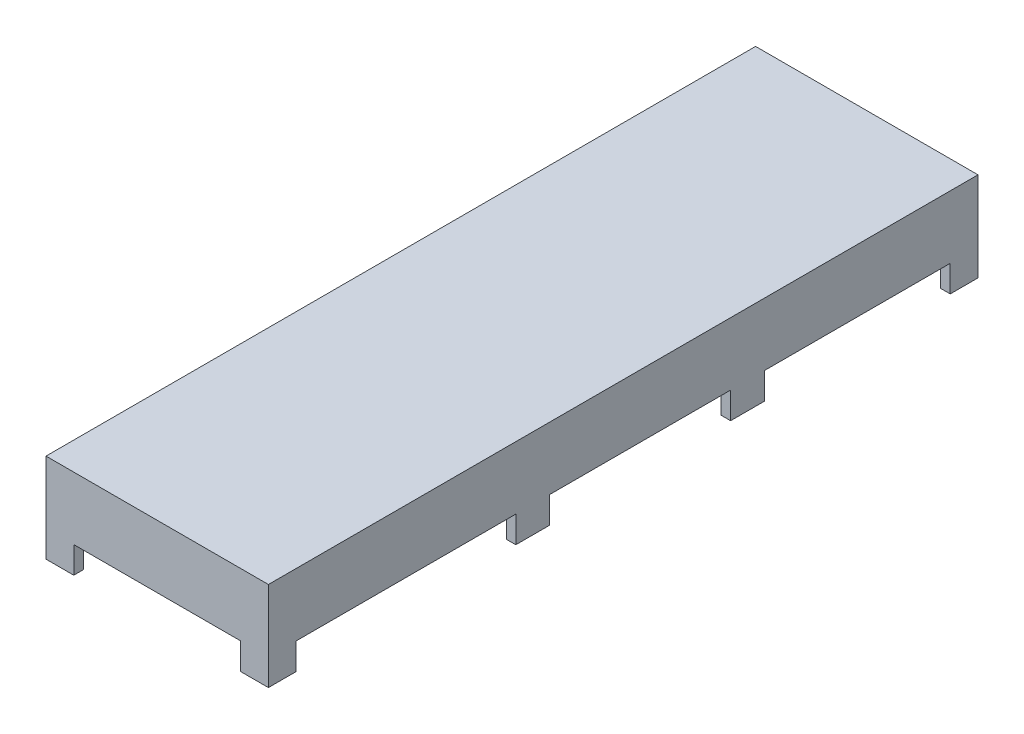
ISO-10303-21;
HEADER;
FILE_DESCRIPTION(('STEP AP214'),'2;1');
FILE_NAME('part.step','',(''),(''),'','','');
FILE_SCHEMA(('AUTOMOTIVE_DESIGN { 1 0 10303 214 1 1 1 1 }'));
ENDSEC;
DATA;
#1=APPLICATION_CONTEXT('core data for automotive mechanical design processes');
#2=APPLICATION_PROTOCOL_DEFINITION('international standard','automotive_design',2000,#1);
#3=PRODUCT_CONTEXT('',#1,'mechanical');
#4=PRODUCT('Part','Part','',(#3));
#5=PRODUCT_RELATED_PRODUCT_CATEGORY('part','',(#4));
#6=PRODUCT_DEFINITION_FORMATION('','',#4);
#7=PRODUCT_DEFINITION_CONTEXT('part definition',#1,'design');
#8=PRODUCT_DEFINITION('design','',#6,#7);
#9=PRODUCT_DEFINITION_SHAPE('','',#8);
#10=(LENGTH_UNIT() NAMED_UNIT(*) SI_UNIT(.MILLI.,.METRE.));
#11=(NAMED_UNIT(*) PLANE_ANGLE_UNIT() SI_UNIT($,.RADIAN.));
#12=(NAMED_UNIT(*) SI_UNIT($,.STERADIAN.) SOLID_ANGLE_UNIT());
#13=UNCERTAINTY_MEASURE_WITH_UNIT(LENGTH_MEASURE(1.E-05),#10,'distance_accuracy_value','');
#14=(GEOMETRIC_REPRESENTATION_CONTEXT(3) GLOBAL_UNCERTAINTY_ASSIGNED_CONTEXT((#13)) GLOBAL_UNIT_ASSIGNED_CONTEXT((#10,
#11,#12)) REPRESENTATION_CONTEXT('',''));
#15=CARTESIAN_POINT('',(0.,0.,0.));
#16=DIRECTION('',(0.,0.,1.));
#17=DIRECTION('',(1.,0.,0.));
#18=AXIS2_PLACEMENT_3D('',#15,#16,#17);
#19=CARTESIAN_POINT('',(0.,0.,0.));
#20=DIRECTION('',(0.,-1.,0.));
#21=DIRECTION('',(0.,0.,-1.));
#22=AXIS2_PLACEMENT_3D('',#19,#20,#21);
#23=PLANE('',#22);
#24=DIRECTION('',(0.,0.,-1.));
#25=VECTOR('',#24,1.);
#26=CARTESIAN_POINT('',(0.4,0.,-0.4));
#27=LINE('',#26,#25);
#28=CARTESIAN_POINT('',(0.399999999999999,0.,-28.25));
#29=VERTEX_POINT('',#28);
#30=CARTESIAN_POINT('',(0.4,0.,-29.));
#31=VERTEX_POINT('',#30);
#32=EDGE_CURVE('E534',#29,#31,#27,.T.);
#33=ORIENTED_EDGE('',*,*,#32,.F.);
#34=DIRECTION('',(-1.,0.,0.));
#35=VECTOR('',#34,1.);
#36=CARTESIAN_POINT('',(9.99999999999999,0.,-28.25));
#37=LINE('',#36,#35);
#38=CARTESIAN_POINT('',(0.,0.,-28.25));
#39=VERTEX_POINT('',#38);
#40=EDGE_CURVE('E399',#29,#39,#37,.T.);
#41=ORIENTED_EDGE('',*,*,#40,.T.);
#42=DIRECTION('',(0.,0.,-1.));
#43=VECTOR('',#42,1.);
#44=CARTESIAN_POINT('',(0.,0.,0.));
#45=LINE('',#44,#43);
#46=CARTESIAN_POINT('',(0.,0.,-29.4));
#47=VERTEX_POINT('',#46);
#48=EDGE_CURVE('E324',#39,#47,#45,.T.);
#49=ORIENTED_EDGE('',*,*,#48,.T.);
#50=DIRECTION('',(1.,0.,0.));
#51=VECTOR('',#50,1.);
#52=CARTESIAN_POINT('',(0.,0.,-29.4));
#53=LINE('',#52,#51);
#54=CARTESIAN_POINT('',(1.15,0.,-29.4));
#55=VERTEX_POINT('',#54);
#56=EDGE_CURVE('E335',#47,#55,#53,.T.);
#57=ORIENTED_EDGE('',*,*,#56,.T.);
#58=DIRECTION('',(0.,0.,1.));
#59=VECTOR('',#58,1.);
#60=CARTESIAN_POINT('',(1.15,0.,-104.93962137689));
#61=LINE('',#60,#59);
#62=CARTESIAN_POINT('',(1.15,0.,-29.));
#63=VERTEX_POINT('',#62);
#64=EDGE_CURVE('E487',#55,#63,#61,.T.);
#65=ORIENTED_EDGE('',*,*,#64,.T.);
#66=DIRECTION('',(1.,0.,0.));
#67=VECTOR('',#66,1.);
#68=CARTESIAN_POINT('',(0.4,0.,-29.));
#69=LINE('',#68,#67);
#70=EDGE_CURVE('E552',#31,#63,#69,.T.);
#71=ORIENTED_EDGE('',*,*,#70,.F.);
#72=EDGE_LOOP('',(#33,#41,#49,#57,#65,#71));
#73=FACE_BOUND('',#72,.T.);
#74=ADVANCED_FACE('F41',(#73),#23,.T.);
#75=CARTESIAN_POINT('',(0.,0.,-19.15));
#76=VERTEX_POINT('',#75);
#77=CARTESIAN_POINT('',(0.,0.,-20.55));
#78=VERTEX_POINT('',#77);
#79=EDGE_CURVE('E314',#76,#78,#45,.T.);
#80=ORIENTED_EDGE('',*,*,#79,.T.);
#81=DIRECTION('',(-1.,0.,0.));
#82=VECTOR('',#81,1.);
#83=CARTESIAN_POINT('',(9.99999999999999,0.,-20.55));
#84=LINE('',#83,#82);
#85=CARTESIAN_POINT('',(0.399999999999999,0.,-20.55));
#86=VERTEX_POINT('',#85);
#87=EDGE_CURVE('E296',#86,#78,#84,.T.);
#88=ORIENTED_EDGE('',*,*,#87,.F.);
#89=CARTESIAN_POINT('',(0.399999999999999,0.,-19.15));
#90=VERTEX_POINT('',#89);
#91=EDGE_CURVE('E724',#90,#86,#27,.T.);
#92=ORIENTED_EDGE('',*,*,#91,.F.);
#93=DIRECTION('',(-1.,0.,0.));
#94=VECTOR('',#93,1.);
#95=CARTESIAN_POINT('',(9.99999999999999,0.,-19.15));
#96=LINE('',#95,#94);
#97=EDGE_CURVE('E322',#90,#76,#96,.T.);
#98=ORIENTED_EDGE('',*,*,#97,.T.);
#99=EDGE_LOOP('',(#80,#88,#92,#98));
#100=FACE_BOUND('',#99,.T.);
#101=ADVANCED_FACE('F321',(#100),#23,.T.);
#102=CARTESIAN_POINT('',(0.399999999999999,0.,-10.25));
#103=VERTEX_POINT('',#102);
#104=CARTESIAN_POINT('',(0.399999999999999,0.,-11.65));
#105=VERTEX_POINT('',#104);
#106=EDGE_CURVE('E551',#103,#105,#27,.T.);
#107=ORIENTED_EDGE('',*,*,#106,.F.);
#108=DIRECTION('',(-1.,0.,0.));
#109=VECTOR('',#108,1.);
#110=CARTESIAN_POINT('',(9.99999999999999,0.,-10.25));
#111=LINE('',#110,#109);
#112=CARTESIAN_POINT('',(0.,0.,-10.25));
#113=VERTEX_POINT('',#112);
#114=EDGE_CURVE('E417',#103,#113,#111,.T.);
#115=ORIENTED_EDGE('',*,*,#114,.T.);
#116=CARTESIAN_POINT('',(0.,0.,-11.65));
#117=VERTEX_POINT('',#116);
#118=EDGE_CURVE('E323',#113,#117,#45,.T.);
#119=ORIENTED_EDGE('',*,*,#118,.T.);
#120=DIRECTION('',(-1.,0.,0.));
#121=VECTOR('',#120,1.);
#122=CARTESIAN_POINT('',(9.99999999999999,0.,-11.65));
#123=LINE('',#122,#121);
#124=EDGE_CURVE('E429',#105,#117,#123,.T.);
#125=ORIENTED_EDGE('',*,*,#124,.F.);
#126=EDGE_LOOP('',(#107,#115,#119,#125));
#127=FACE_BOUND('',#126,.T.);
#128=ADVANCED_FACE('F677',(#127),#23,.T.);
#129=CARTESIAN_POINT('',(0.,0.,0.));
#130=VERTEX_POINT('',#129);
#131=CARTESIAN_POINT('',(0.,0.,-1.15));
#132=VERTEX_POINT('',#131);
#133=EDGE_CURVE('E327',#130,#132,#45,.T.);
#134=ORIENTED_EDGE('',*,*,#133,.T.);
#135=DIRECTION('',(-1.,0.,0.));
#136=VECTOR('',#135,1.);
#137=CARTESIAN_POINT('',(9.99999999999999,0.,-1.15));
#138=LINE('',#137,#136);
#139=CARTESIAN_POINT('',(0.399999999999999,0.,-1.15));
#140=VERTEX_POINT('',#139);
#141=EDGE_CURVE('E408',#140,#132,#138,.T.);
#142=ORIENTED_EDGE('',*,*,#141,.F.);
#143=CARTESIAN_POINT('',(0.4,0.,-0.4));
#144=VERTEX_POINT('',#143);
#145=EDGE_CURVE('E547',#144,#140,#27,.T.);
#146=ORIENTED_EDGE('',*,*,#145,.F.);
#147=DIRECTION('',(1.,0.,0.));
#148=VECTOR('',#147,1.);
#149=CARTESIAN_POINT('',(0.4,0.,-0.4));
#150=LINE('',#149,#148);
#151=CARTESIAN_POINT('',(1.15,0.,-0.399999999999999));
#152=VERTEX_POINT('',#151);
#153=EDGE_CURVE('E539',#144,#152,#150,.T.);
#154=ORIENTED_EDGE('',*,*,#153,.T.);
#155=DIRECTION('',(0.,0.,-1.));
#156=VECTOR('',#155,1.);
#157=CARTESIAN_POINT('',(1.15,0.,38.7896213768902));
#158=LINE('',#157,#156);
#159=CARTESIAN_POINT('',(1.15,0.,0.));
#160=VERTEX_POINT('',#159);
#161=EDGE_CURVE('E511',#160,#152,#158,.T.);
#162=ORIENTED_EDGE('',*,*,#161,.F.);
#163=DIRECTION('',(1.,0.,0.));
#164=VECTOR('',#163,1.);
#165=CARTESIAN_POINT('',(0.,0.,0.));
#166=LINE('',#165,#164);
#167=EDGE_CURVE('E344',#130,#160,#166,.T.);
#168=ORIENTED_EDGE('',*,*,#167,.F.);
#169=EDGE_LOOP('',(#134,#142,#146,#154,#162,#168));
#170=FACE_BOUND('',#169,.T.);
#171=ADVANCED_FACE('F601',(#170),#23,.T.);
#172=DIRECTION('',(0.,0.,-1.));
#173=VECTOR('',#172,1.);
#174=CARTESIAN_POINT('',(9.215,0.,0.));
#175=LINE('',#174,#173);
#176=CARTESIAN_POINT('',(9.215,0.,-28.25));
#177=VERTEX_POINT('',#176);
#178=CARTESIAN_POINT('',(9.215,0.,-29.4));
#179=VERTEX_POINT('',#178);
#180=EDGE_CURVE('E338',#177,#179,#175,.T.);
#181=ORIENTED_EDGE('',*,*,#180,.F.);
#182=CARTESIAN_POINT('',(8.82,0.,-28.25));
#183=VERTEX_POINT('',#182);
#184=EDGE_CURVE('E403',#177,#183,#37,.T.);
#185=ORIENTED_EDGE('',*,*,#184,.T.);
#186=DIRECTION('',(0.,0.,-1.));
#187=VECTOR('',#186,1.);
#188=CARTESIAN_POINT('',(8.82,0.,-0.4));
#189=LINE('',#188,#187);
#190=CARTESIAN_POINT('',(8.82,0.,-29.));
#191=VERTEX_POINT('',#190);
#192=EDGE_CURVE('E555',#183,#191,#189,.T.);
#193=ORIENTED_EDGE('',*,*,#192,.T.);
#194=CARTESIAN_POINT('',(8.065,0.,-29.));
#195=VERTEX_POINT('',#194);
#196=EDGE_CURVE('E550',#195,#191,#69,.T.);
#197=ORIENTED_EDGE('',*,*,#196,.F.);
#198=DIRECTION('',(0.,0.,1.));
#199=VECTOR('',#198,1.);
#200=CARTESIAN_POINT('',(8.065,0.,-104.93962137689));
#201=LINE('',#200,#199);
#202=CARTESIAN_POINT('',(8.065,0.,-29.4));
#203=VERTEX_POINT('',#202);
#204=EDGE_CURVE('E500',#203,#195,#201,.T.);
#205=ORIENTED_EDGE('',*,*,#204,.F.);
#206=EDGE_CURVE('E332',#203,#179,#53,.T.);
#207=ORIENTED_EDGE('',*,*,#206,.T.);
#208=EDGE_LOOP('',(#181,#185,#193,#197,#205,#207));
#209=FACE_BOUND('',#208,.T.);
#210=ADVANCED_FACE('F689',(#209),#23,.T.);
#211=CARTESIAN_POINT('',(8.82,0.,-19.15));
#212=VERTEX_POINT('',#211);
#213=CARTESIAN_POINT('',(8.82,0.,-20.55));
#214=VERTEX_POINT('',#213);
#215=EDGE_CURVE('E655',#212,#214,#189,.T.);
#216=ORIENTED_EDGE('',*,*,#215,.T.);
#217=CARTESIAN_POINT('',(9.215,0.,-20.55));
#218=VERTEX_POINT('',#217);
#219=EDGE_CURVE('E307',#218,#214,#84,.T.);
#220=ORIENTED_EDGE('',*,*,#219,.F.);
#221=CARTESIAN_POINT('',(9.215,0.,-19.15));
#222=VERTEX_POINT('',#221);
#223=EDGE_CURVE('E645',#222,#218,#175,.T.);
#224=ORIENTED_EDGE('',*,*,#223,.F.);
#225=EDGE_CURVE('E438',#222,#212,#96,.T.);
#226=ORIENTED_EDGE('',*,*,#225,.T.);
#227=EDGE_LOOP('',(#216,#220,#224,#226));
#228=FACE_BOUND('',#227,.T.);
#229=ADVANCED_FACE('F654',(#228),#23,.T.);
#230=CARTESIAN_POINT('',(9.215,0.,-10.25));
#231=VERTEX_POINT('',#230);
#232=CARTESIAN_POINT('',(9.215,0.,-11.65));
#233=VERTEX_POINT('',#232);
#234=EDGE_CURVE('E343',#231,#233,#175,.T.);
#235=ORIENTED_EDGE('',*,*,#234,.F.);
#236=CARTESIAN_POINT('',(8.82,0.,-10.25));
#237=VERTEX_POINT('',#236);
#238=EDGE_CURVE('E416',#231,#237,#111,.T.);
#239=ORIENTED_EDGE('',*,*,#238,.T.);
#240=CARTESIAN_POINT('',(8.82,0.,-11.65));
#241=VERTEX_POINT('',#240);
#242=EDGE_CURVE('E560',#237,#241,#189,.T.);
#243=ORIENTED_EDGE('',*,*,#242,.T.);
#244=EDGE_CURVE('E431',#233,#241,#123,.T.);
#245=ORIENTED_EDGE('',*,*,#244,.F.);
#246=EDGE_LOOP('',(#235,#239,#243,#245));
#247=FACE_BOUND('',#246,.T.);
#248=ADVANCED_FACE('F641',(#247),#23,.T.);
#249=CARTESIAN_POINT('',(8.82,0.,-0.4));
#250=VERTEX_POINT('',#249);
#251=CARTESIAN_POINT('',(8.82,0.,-1.15));
#252=VERTEX_POINT('',#251);
#253=EDGE_CURVE('E556',#250,#252,#189,.T.);
#254=ORIENTED_EDGE('',*,*,#253,.T.);
#255=CARTESIAN_POINT('',(9.215,0.,-1.15));
#256=VERTEX_POINT('',#255);
#257=EDGE_CURVE('E410',#256,#252,#138,.T.);
#258=ORIENTED_EDGE('',*,*,#257,.F.);
#259=CARTESIAN_POINT('',(9.215,0.,0.));
#260=VERTEX_POINT('',#259);
#261=EDGE_CURVE('E339',#260,#256,#175,.T.);
#262=ORIENTED_EDGE('',*,*,#261,.F.);
#263=CARTESIAN_POINT('',(8.065,0.,0.));
#264=VERTEX_POINT('',#263);
#265=EDGE_CURVE('E342',#264,#260,#166,.T.);
#266=ORIENTED_EDGE('',*,*,#265,.F.);
#267=DIRECTION('',(0.,0.,-1.));
#268=VECTOR('',#267,1.);
#269=CARTESIAN_POINT('',(8.065,0.,38.7896213768902));
#270=LINE('',#269,#268);
#271=CARTESIAN_POINT('',(8.065,0.,-0.399999999999999));
#272=VERTEX_POINT('',#271);
#273=EDGE_CURVE('E531',#264,#272,#270,.T.);
#274=ORIENTED_EDGE('',*,*,#273,.T.);
#275=EDGE_CURVE('E559',#272,#250,#150,.T.);
#276=ORIENTED_EDGE('',*,*,#275,.T.);
#277=EDGE_LOOP('',(#254,#258,#262,#266,#274,#276));
#278=FACE_BOUND('',#277,.T.);
#279=ADVANCED_FACE('F620',(#278),#23,.T.);
#280=CARTESIAN_POINT('',(0.,3.7,0.));
#281=DIRECTION('',(-1.,0.,0.));
#282=DIRECTION('',(0.,0.,1.));
#283=AXIS2_PLACEMENT_3D('',#280,#281,#282);
#284=PLANE('',#283);
#285=ORIENTED_EDGE('',*,*,#48,.F.);
#286=DIRECTION('',(0.,1.,0.));
#287=VECTOR('',#286,1.);
#288=CARTESIAN_POINT('',(0.,0.,-28.25));
#289=LINE('',#288,#287);
#290=CARTESIAN_POINT('',(0.,1.1,-28.25));
#291=VERTEX_POINT('',#290);
#292=EDGE_CURVE('E308',#39,#291,#289,.T.);
#293=ORIENTED_EDGE('',*,*,#292,.T.);
#294=DIRECTION('',(0.,0.,1.));
#295=VECTOR('',#294,1.);
#296=CARTESIAN_POINT('',(0.,1.1,-28.25));
#297=LINE('',#296,#295);
#298=CARTESIAN_POINT('',(0.,1.1,-20.55));
#299=VERTEX_POINT('',#298);
#300=EDGE_CURVE('E317',#291,#299,#297,.T.);
#301=ORIENTED_EDGE('',*,*,#300,.T.);
#302=DIRECTION('',(0.,-1.,0.));
#303=VECTOR('',#302,1.);
#304=CARTESIAN_POINT('',(0.,1.1,-20.55));
#305=LINE('',#304,#303);
#306=EDGE_CURVE('E299',#299,#78,#305,.T.);
#307=ORIENTED_EDGE('',*,*,#306,.T.);
#308=ORIENTED_EDGE('',*,*,#79,.F.);
#309=DIRECTION('',(0.,1.,0.));
#310=VECTOR('',#309,1.);
#311=CARTESIAN_POINT('',(0.,0.,-19.15));
#312=LINE('',#311,#310);
#313=CARTESIAN_POINT('',(0.,1.1,-19.15));
#314=VERTEX_POINT('',#313);
#315=EDGE_CURVE('E440',#76,#314,#312,.T.);
#316=ORIENTED_EDGE('',*,*,#315,.T.);
#317=DIRECTION('',(0.,0.,1.));
#318=VECTOR('',#317,1.);
#319=CARTESIAN_POINT('',(0.,1.1,-19.15));
#320=LINE('',#319,#318);
#321=CARTESIAN_POINT('',(0.,1.1,-11.65));
#322=VERTEX_POINT('',#321);
#323=EDGE_CURVE('E442',#314,#322,#320,.T.);
#324=ORIENTED_EDGE('',*,*,#323,.T.);
#325=DIRECTION('',(0.,-1.,0.));
#326=VECTOR('',#325,1.);
#327=CARTESIAN_POINT('',(0.,1.1,-11.65));
#328=LINE('',#327,#326);
#329=EDGE_CURVE('E420',#322,#117,#328,.T.);
#330=ORIENTED_EDGE('',*,*,#329,.T.);
#331=ORIENTED_EDGE('',*,*,#118,.F.);
#332=DIRECTION('',(0.,1.,0.));
#333=VECTOR('',#332,1.);
#334=CARTESIAN_POINT('',(0.,0.,-10.25));
#335=LINE('',#334,#333);
#336=CARTESIAN_POINT('',(0.,1.1,-10.25));
#337=VERTEX_POINT('',#336);
#338=EDGE_CURVE('E421',#113,#337,#335,.T.);
#339=ORIENTED_EDGE('',*,*,#338,.T.);
#340=DIRECTION('',(0.,0.,1.));
#341=VECTOR('',#340,1.);
#342=CARTESIAN_POINT('',(0.,1.1,-10.25));
#343=LINE('',#342,#341);
#344=CARTESIAN_POINT('',(0.,1.1,-1.15));
#345=VERTEX_POINT('',#344);
#346=EDGE_CURVE('E424',#337,#345,#343,.T.);
#347=ORIENTED_EDGE('',*,*,#346,.T.);
#348=DIRECTION('',(0.,-1.,0.));
#349=VECTOR('',#348,1.);
#350=CARTESIAN_POINT('',(0.,1.1,-1.15));
#351=LINE('',#350,#349);
#352=EDGE_CURVE('E318',#345,#132,#351,.T.);
#353=ORIENTED_EDGE('',*,*,#352,.T.);
#354=ORIENTED_EDGE('',*,*,#133,.F.);
#355=DIRECTION('',(0.,-1.,0.));
#356=VECTOR('',#355,1.);
#357=CARTESIAN_POINT('',(0.,3.7,0.));
#358=LINE('',#357,#356);
#359=CARTESIAN_POINT('',(0.,3.7,0.));
#360=VERTEX_POINT('',#359);
#361=EDGE_CURVE('E348',#360,#130,#358,.T.);
#362=ORIENTED_EDGE('',*,*,#361,.F.);
#363=DIRECTION('',(0.,0.,-1.));
#364=VECTOR('',#363,1.);
#365=CARTESIAN_POINT('',(0.,3.7,0.));
#366=LINE('',#365,#364);
#367=CARTESIAN_POINT('',(0.,3.7,-29.4));
#368=VERTEX_POINT('',#367);
#369=EDGE_CURVE('E347',#360,#368,#366,.T.);
#370=ORIENTED_EDGE('',*,*,#369,.T.);
#371=DIRECTION('',(0.,-1.,0.));
#372=VECTOR('',#371,1.);
#373=CARTESIAN_POINT('',(0.,3.7,-29.4));
#374=LINE('',#373,#372);
#375=EDGE_CURVE('E357',#368,#47,#374,.T.);
#376=ORIENTED_EDGE('',*,*,#375,.T.);
#377=EDGE_LOOP('',(#285,#293,#301,#307,#308,#316,#324,#330,#331,#339,#347,#353,#354,#362,#370,#376));
#378=FACE_BOUND('',#377,.T.);
#379=ADVANCED_FACE('F43',(#378),#284,.T.);
#380=CARTESIAN_POINT('',(9.215,3.7,0.));
#381=DIRECTION('',(-1.,0.,0.));
#382=DIRECTION('',(0.,0.,1.));
#383=AXIS2_PLACEMENT_3D('',#380,#381,#382);
#384=PLANE('',#383);
#385=DIRECTION('',(0.,1.,0.));
#386=VECTOR('',#385,1.);
#387=CARTESIAN_POINT('',(9.215,3.7,-28.25));
#388=LINE('',#387,#386);
#389=CARTESIAN_POINT('',(9.215,1.1,-28.25));
#390=VERTEX_POINT('',#389);
#391=EDGE_CURVE('E398',#177,#390,#388,.T.);
#392=ORIENTED_EDGE('',*,*,#391,.F.);
#393=ORIENTED_EDGE('',*,*,#180,.T.);
#394=DIRECTION('',(0.,-1.,0.));
#395=VECTOR('',#394,1.);
#396=CARTESIAN_POINT('',(9.215,3.7,-29.4));
#397=LINE('',#396,#395);
#398=CARTESIAN_POINT('',(9.215,3.7,-29.4));
#399=VERTEX_POINT('',#398);
#400=EDGE_CURVE('E354',#399,#179,#397,.T.);
#401=ORIENTED_EDGE('',*,*,#400,.F.);
#402=DIRECTION('',(0.,0.,-1.));
#403=VECTOR('',#402,1.);
#404=CARTESIAN_POINT('',(9.215,3.7,0.));
#405=LINE('',#404,#403);
#406=CARTESIAN_POINT('',(9.215,3.7,0.));
#407=VERTEX_POINT('',#406);
#408=EDGE_CURVE('E576',#407,#399,#405,.T.);
#409=ORIENTED_EDGE('',*,*,#408,.F.);
#410=DIRECTION('',(0.,-1.,0.));
#411=VECTOR('',#410,1.);
#412=CARTESIAN_POINT('',(9.215,3.7,0.));
#413=LINE('',#412,#411);
#414=EDGE_CURVE('E351',#407,#260,#413,.T.);
#415=ORIENTED_EDGE('',*,*,#414,.T.);
#416=ORIENTED_EDGE('',*,*,#261,.T.);
#417=DIRECTION('',(0.,-1.,0.));
#418=VECTOR('',#417,1.);
#419=CARTESIAN_POINT('',(9.215,3.7,-1.15));
#420=LINE('',#419,#418);
#421=CARTESIAN_POINT('',(9.215,1.1,-1.15));
#422=VERTEX_POINT('',#421);
#423=EDGE_CURVE('E462',#422,#256,#420,.T.);
#424=ORIENTED_EDGE('',*,*,#423,.F.);
#425=DIRECTION('',(0.,0.,1.));
#426=VECTOR('',#425,1.);
#427=CARTESIAN_POINT('',(9.215,1.1,0.));
#428=LINE('',#427,#426);
#429=CARTESIAN_POINT('',(9.215,1.1,-10.25));
#430=VERTEX_POINT('',#429);
#431=EDGE_CURVE('E466',#430,#422,#428,.T.);
#432=ORIENTED_EDGE('',*,*,#431,.F.);
#433=DIRECTION('',(0.,1.,0.));
#434=VECTOR('',#433,1.);
#435=CARTESIAN_POINT('',(9.215,3.7,-10.25));
#436=LINE('',#435,#434);
#437=EDGE_CURVE('E470',#231,#430,#436,.T.);
#438=ORIENTED_EDGE('',*,*,#437,.F.);
#439=ORIENTED_EDGE('',*,*,#234,.T.);
#440=DIRECTION('',(0.,-1.,0.));
#441=VECTOR('',#440,1.);
#442=CARTESIAN_POINT('',(9.215,3.7,-11.65));
#443=LINE('',#442,#441);
#444=CARTESIAN_POINT('',(9.215,1.1,-11.65));
#445=VERTEX_POINT('',#444);
#446=EDGE_CURVE('E449',#445,#233,#443,.T.);
#447=ORIENTED_EDGE('',*,*,#446,.F.);
#448=DIRECTION('',(0.,0.,1.));
#449=VECTOR('',#448,1.);
#450=CARTESIAN_POINT('',(9.215,1.1,0.));
#451=LINE('',#450,#449);
#452=CARTESIAN_POINT('',(9.215,1.1,-19.15));
#453=VERTEX_POINT('',#452);
#454=EDGE_CURVE('E454',#453,#445,#451,.T.);
#455=ORIENTED_EDGE('',*,*,#454,.F.);
#456=DIRECTION('',(0.,1.,0.));
#457=VECTOR('',#456,1.);
#458=CARTESIAN_POINT('',(9.215,3.7,-19.15));
#459=LINE('',#458,#457);
#460=EDGE_CURVE('E458',#222,#453,#459,.T.);
#461=ORIENTED_EDGE('',*,*,#460,.F.);
#462=ORIENTED_EDGE('',*,*,#223,.T.);
#463=DIRECTION('',(0.,-1.,0.));
#464=VECTOR('',#463,1.);
#465=CARTESIAN_POINT('',(9.215,3.7,-20.55));
#466=LINE('',#465,#464);
#467=CARTESIAN_POINT('',(9.215,1.1,-20.55));
#468=VERTEX_POINT('',#467);
#469=EDGE_CURVE('E473',#468,#218,#466,.T.);
#470=ORIENTED_EDGE('',*,*,#469,.F.);
#471=DIRECTION('',(0.,0.,1.));
#472=VECTOR('',#471,1.);
#473=CARTESIAN_POINT('',(9.215,1.1,0.));
#474=LINE('',#473,#472);
#475=EDGE_CURVE('E477',#390,#468,#474,.T.);
#476=ORIENTED_EDGE('',*,*,#475,.F.);
#477=EDGE_LOOP('',(#392,#393,#401,#409,#415,#416,#424,#432,#438,#439,#447,#455,#461,#462,#470,#476));
#478=FACE_BOUND('',#477,.T.);
#479=ADVANCED_FACE('F590',(#478),#384,.F.);
#480=CARTESIAN_POINT('',(0.4,3.3,-0.4));
#481=DIRECTION('',(-1.,0.,0.));
#482=DIRECTION('',(0.,0.,1.));
#483=AXIS2_PLACEMENT_3D('',#480,#481,#482);
#484=PLANE('',#483);
#485=DIRECTION('',(0.,1.,0.));
#486=VECTOR('',#485,1.);
#487=CARTESIAN_POINT('',(0.4,3.3,-28.25));
#488=LINE('',#487,#486);
#489=CARTESIAN_POINT('',(0.399999999999999,1.1,-28.25));
#490=VERTEX_POINT('',#489);
#491=EDGE_CURVE('E479',#29,#490,#488,.T.);
#492=ORIENTED_EDGE('',*,*,#491,.F.);
#493=ORIENTED_EDGE('',*,*,#32,.T.);
#494=DIRECTION('',(0.,-1.,0.));
#495=VECTOR('',#494,1.);
#496=CARTESIAN_POINT('',(0.4,3.3,-29.));
#497=LINE('',#496,#495);
#498=CARTESIAN_POINT('',(0.4,3.3,-29.));
#499=VERTEX_POINT('',#498);
#500=EDGE_CURVE('E546',#499,#31,#497,.T.);
#501=ORIENTED_EDGE('',*,*,#500,.F.);
#502=DIRECTION('',(0.,0.,-1.));
#503=VECTOR('',#502,1.);
#504=CARTESIAN_POINT('',(0.4,3.3,-0.4));
#505=LINE('',#504,#503);
#506=CARTESIAN_POINT('',(0.4,3.3,-0.4));
#507=VERTEX_POINT('',#506);
#508=EDGE_CURVE('E535',#507,#499,#505,.T.);
#509=ORIENTED_EDGE('',*,*,#508,.F.);
#510=DIRECTION('',(0.,-1.,0.));
#511=VECTOR('',#510,1.);
#512=CARTESIAN_POINT('',(0.4,3.3,-0.4));
#513=LINE('',#512,#511);
#514=EDGE_CURVE('E328',#507,#144,#513,.T.);
#515=ORIENTED_EDGE('',*,*,#514,.T.);
#516=ORIENTED_EDGE('',*,*,#145,.T.);
#517=DIRECTION('',(0.,-1.,0.));
#518=VECTOR('',#517,1.);
#519=CARTESIAN_POINT('',(0.4,3.3,-1.15));
#520=LINE('',#519,#518);
#521=CARTESIAN_POINT('',(0.4,1.1,-1.15));
#522=VERTEX_POINT('',#521);
#523=EDGE_CURVE('E460',#522,#140,#520,.T.);
#524=ORIENTED_EDGE('',*,*,#523,.F.);
#525=DIRECTION('',(0.,0.,1.));
#526=VECTOR('',#525,1.);
#527=CARTESIAN_POINT('',(0.4,1.1,-0.4));
#528=LINE('',#527,#526);
#529=CARTESIAN_POINT('',(0.399999999999999,1.1,-10.25));
#530=VERTEX_POINT('',#529);
#531=EDGE_CURVE('E464',#530,#522,#528,.T.);
#532=ORIENTED_EDGE('',*,*,#531,.F.);
#533=DIRECTION('',(0.,1.,0.));
#534=VECTOR('',#533,1.);
#535=CARTESIAN_POINT('',(0.4,3.3,-10.25));
#536=LINE('',#535,#534);
#537=EDGE_CURVE('E468',#103,#530,#536,.T.);
#538=ORIENTED_EDGE('',*,*,#537,.F.);
#539=ORIENTED_EDGE('',*,*,#106,.T.);
#540=DIRECTION('',(0.,-1.,0.));
#541=VECTOR('',#540,1.);
#542=CARTESIAN_POINT('',(0.4,3.3,-11.65));
#543=LINE('',#542,#541);
#544=CARTESIAN_POINT('',(0.4,1.1,-11.65));
#545=VERTEX_POINT('',#544);
#546=EDGE_CURVE('E447',#545,#105,#543,.T.);
#547=ORIENTED_EDGE('',*,*,#546,.F.);
#548=DIRECTION('',(0.,0.,1.));
#549=VECTOR('',#548,1.);
#550=CARTESIAN_POINT('',(0.4,1.1,-0.4));
#551=LINE('',#550,#549);
#552=CARTESIAN_POINT('',(0.399999999999999,1.1,-19.15));
#553=VERTEX_POINT('',#552);
#554=EDGE_CURVE('E451',#553,#545,#551,.T.);
#555=ORIENTED_EDGE('',*,*,#554,.F.);
#556=DIRECTION('',(0.,1.,0.));
#557=VECTOR('',#556,1.);
#558=CARTESIAN_POINT('',(0.4,3.3,-19.15));
#559=LINE('',#558,#557);
#560=EDGE_CURVE('E456',#90,#553,#559,.T.);
#561=ORIENTED_EDGE('',*,*,#560,.F.);
#562=ORIENTED_EDGE('',*,*,#91,.T.);
#563=DIRECTION('',(0.,-1.,0.));
#564=VECTOR('',#563,1.);
#565=CARTESIAN_POINT('',(0.4,3.3,-20.55));
#566=LINE('',#565,#564);
#567=CARTESIAN_POINT('',(0.4,1.1,-20.55));
#568=VERTEX_POINT('',#567);
#569=EDGE_CURVE('E302',#568,#86,#566,.T.);
#570=ORIENTED_EDGE('',*,*,#569,.F.);
#571=DIRECTION('',(0.,0.,1.));
#572=VECTOR('',#571,1.);
#573=CARTESIAN_POINT('',(0.4,1.1,-0.4));
#574=LINE('',#573,#572);
#575=EDGE_CURVE('E475',#490,#568,#574,.T.);
#576=ORIENTED_EDGE('',*,*,#575,.F.);
#577=EDGE_LOOP('',(#492,#493,#501,#509,#515,#516,#524,#532,#538,#539,#547,#555,#561,#562,#570,#576));
#578=FACE_BOUND('',#577,.T.);
#579=ADVANCED_FACE('F722',(#578),#484,.F.);
#580=CARTESIAN_POINT('',(8.82,3.3,-0.4));
#581=DIRECTION('',(-1.,0.,0.));
#582=DIRECTION('',(0.,0.,1.));
#583=AXIS2_PLACEMENT_3D('',#580,#581,#582);
#584=PLANE('',#583);
#585=ORIENTED_EDGE('',*,*,#192,.F.);
#586=DIRECTION('',(0.,1.,0.));
#587=VECTOR('',#586,1.);
#588=CARTESIAN_POINT('',(8.82,3.3,-28.25));
#589=LINE('',#588,#587);
#590=CARTESIAN_POINT('',(8.82,1.1,-28.25));
#591=VERTEX_POINT('',#590);
#592=EDGE_CURVE('E11',#183,#591,#589,.T.);
#593=ORIENTED_EDGE('',*,*,#592,.T.);
#594=DIRECTION('',(0.,0.,1.));
#595=VECTOR('',#594,1.);
#596=CARTESIAN_POINT('',(8.82,1.1,-0.4));
#597=LINE('',#596,#595);
#598=CARTESIAN_POINT('',(8.82,1.1,-20.55));
#599=VERTEX_POINT('',#598);
#600=EDGE_CURVE('E49',#591,#599,#597,.T.);
#601=ORIENTED_EDGE('',*,*,#600,.T.);
#602=DIRECTION('',(0.,-1.,0.));
#603=VECTOR('',#602,1.);
#604=CARTESIAN_POINT('',(8.82,3.3,-20.55));
#605=LINE('',#604,#603);
#606=EDGE_CURVE('E377',#599,#214,#605,.T.);
#607=ORIENTED_EDGE('',*,*,#606,.T.);
#608=ORIENTED_EDGE('',*,*,#215,.F.);
#609=DIRECTION('',(0.,1.,0.));
#610=VECTOR('',#609,1.);
#611=CARTESIAN_POINT('',(8.82,3.3,-19.15));
#612=LINE('',#611,#610);
#613=CARTESIAN_POINT('',(8.82,1.1,-19.15));
#614=VERTEX_POINT('',#613);
#615=EDGE_CURVE('E365',#212,#614,#612,.T.);
#616=ORIENTED_EDGE('',*,*,#615,.T.);
#617=DIRECTION('',(0.,0.,1.));
#618=VECTOR('',#617,1.);
#619=CARTESIAN_POINT('',(8.82,1.1,-0.4));
#620=LINE('',#619,#618);
#621=CARTESIAN_POINT('',(8.82,1.1,-11.65));
#622=VERTEX_POINT('',#621);
#623=EDGE_CURVE('E362',#614,#622,#620,.T.);
#624=ORIENTED_EDGE('',*,*,#623,.T.);
#625=DIRECTION('',(0.,-1.,0.));
#626=VECTOR('',#625,1.);
#627=CARTESIAN_POINT('',(8.82,3.3,-11.65));
#628=LINE('',#627,#626);
#629=EDGE_CURVE('E350',#622,#241,#628,.T.);
#630=ORIENTED_EDGE('',*,*,#629,.T.);
#631=ORIENTED_EDGE('',*,*,#242,.F.);
#632=DIRECTION('',(0.,1.,0.));
#633=VECTOR('',#632,1.);
#634=CARTESIAN_POINT('',(8.82,3.3,-10.25));
#635=LINE('',#634,#633);
#636=CARTESIAN_POINT('',(8.82,1.1,-10.25));
#637=VERTEX_POINT('',#636);
#638=EDGE_CURVE('E374',#237,#637,#635,.T.);
#639=ORIENTED_EDGE('',*,*,#638,.T.);
#640=DIRECTION('',(0.,0.,1.));
#641=VECTOR('',#640,1.);
#642=CARTESIAN_POINT('',(8.82,1.1,-0.4));
#643=LINE('',#642,#641);
#644=CARTESIAN_POINT('',(8.82,1.1,-1.15));
#645=VERTEX_POINT('',#644);
#646=EDGE_CURVE('E371',#637,#645,#643,.T.);
#647=ORIENTED_EDGE('',*,*,#646,.T.);
#648=DIRECTION('',(0.,-1.,0.));
#649=VECTOR('',#648,1.);
#650=CARTESIAN_POINT('',(8.82,3.3,-1.15));
#651=LINE('',#650,#649);
#652=EDGE_CURVE('E368',#645,#252,#651,.T.);
#653=ORIENTED_EDGE('',*,*,#652,.T.);
#654=ORIENTED_EDGE('',*,*,#253,.F.);
#655=DIRECTION('',(0.,-1.,0.));
#656=VECTOR('',#655,1.);
#657=CARTESIAN_POINT('',(8.82,3.3,-0.4));
#658=LINE('',#657,#656);
#659=CARTESIAN_POINT('',(8.82,3.3,-0.4));
#660=VERTEX_POINT('',#659);
#661=EDGE_CURVE('E564',#660,#250,#658,.T.);
#662=ORIENTED_EDGE('',*,*,#661,.F.);
#663=DIRECTION('',(0.,0.,-1.));
#664=VECTOR('',#663,1.);
#665=CARTESIAN_POINT('',(8.82,3.3,-0.4));
#666=LINE('',#665,#664);
#667=CARTESIAN_POINT('',(8.82,3.3,-29.));
#668=VERTEX_POINT('',#667);
#669=EDGE_CURVE('E542',#660,#668,#666,.T.);
#670=ORIENTED_EDGE('',*,*,#669,.T.);
#671=DIRECTION('',(0.,-1.,0.));
#672=VECTOR('',#671,1.);
#673=CARTESIAN_POINT('',(8.82,3.3,-29.));
#674=LINE('',#673,#672);
#675=EDGE_CURVE('E567',#668,#191,#674,.T.);
#676=ORIENTED_EDGE('',*,*,#675,.T.);
#677=EDGE_LOOP('',(#585,#593,#601,#607,#608,#616,#624,#630,#631,#639,#647,#653,#654,#662,#670,#676));
#678=FACE_BOUND('',#677,.T.);
#679=ADVANCED_FACE('F382',(#678),#584,.T.);
#680=CARTESIAN_POINT('',(0.,3.7,-29.4));
#681=DIRECTION('',(0.,0.,-1.));
#682=DIRECTION('',(-1.,0.,0.));
#683=AXIS2_PLACEMENT_3D('',#680,#681,#682);
#684=PLANE('',#683);
#685=DIRECTION('',(-1.,0.,0.));
#686=VECTOR('',#685,1.);
#687=CARTESIAN_POINT('',(8.065,1.1,-29.4));
#688=LINE('',#687,#686);
#689=CARTESIAN_POINT('',(8.065,1.1,-29.4));
#690=VERTEX_POINT('',#689);
#691=CARTESIAN_POINT('',(1.15,1.1,-29.4));
#692=VERTEX_POINT('',#691);
#693=EDGE_CURVE('E486',#690,#692,#688,.T.);
#694=ORIENTED_EDGE('',*,*,#693,.T.);
#695=DIRECTION('',(0.,-1.,0.));
#696=VECTOR('',#695,1.);
#697=CARTESIAN_POINT('',(1.15,1.1,-29.4));
#698=LINE('',#697,#696);
#699=EDGE_CURVE('E483',#692,#55,#698,.T.);
#700=ORIENTED_EDGE('',*,*,#699,.T.);
#701=ORIENTED_EDGE('',*,*,#56,.F.);
#702=ORIENTED_EDGE('',*,*,#375,.F.);
#703=DIRECTION('',(1.,0.,0.));
#704=VECTOR('',#703,1.);
#705=CARTESIAN_POINT('',(0.,3.7,-29.4));
#706=LINE('',#705,#704);
#707=EDGE_CURVE('E574',#368,#399,#706,.T.);
#708=ORIENTED_EDGE('',*,*,#707,.T.);
#709=ORIENTED_EDGE('',*,*,#400,.T.);
#710=ORIENTED_EDGE('',*,*,#206,.F.);
#711=DIRECTION('',(0.,1.,0.));
#712=VECTOR('',#711,1.);
#713=CARTESIAN_POINT('',(8.065,0.,-29.4));
#714=LINE('',#713,#712);
#715=EDGE_CURVE('E490',#203,#690,#714,.T.);
#716=ORIENTED_EDGE('',*,*,#715,.T.);
#717=EDGE_LOOP('',(#694,#700,#701,#702,#708,#709,#710,#716));
#718=FACE_BOUND('',#717,.T.);
#719=ADVANCED_FACE('F595',(#718),#684,.T.);
#720=CARTESIAN_POINT('',(0.4,3.3,-29.));
#721=DIRECTION('',(0.,0.,-1.));
#722=DIRECTION('',(-1.,0.,0.));
#723=AXIS2_PLACEMENT_3D('',#720,#721,#722);
#724=PLANE('',#723);
#725=DIRECTION('',(0.,1.,0.));
#726=VECTOR('',#725,1.);
#727=CARTESIAN_POINT('',(8.065,0.,-29.));
#728=LINE('',#727,#726);
#729=CARTESIAN_POINT('',(8.065,1.1,-29.));
#730=VERTEX_POINT('',#729);
#731=EDGE_CURVE('E482',#195,#730,#728,.T.);
#732=ORIENTED_EDGE('',*,*,#731,.F.);
#733=ORIENTED_EDGE('',*,*,#196,.T.);
#734=ORIENTED_EDGE('',*,*,#675,.F.);
#735=DIRECTION('',(1.,0.,0.));
#736=VECTOR('',#735,1.);
#737=CARTESIAN_POINT('',(0.4,3.3,-29.));
#738=LINE('',#737,#736);
#739=EDGE_CURVE('E538',#499,#668,#738,.T.);
#740=ORIENTED_EDGE('',*,*,#739,.F.);
#741=ORIENTED_EDGE('',*,*,#500,.T.);
#742=ORIENTED_EDGE('',*,*,#70,.T.);
#743=DIRECTION('',(0.,-1.,0.));
#744=VECTOR('',#743,1.);
#745=CARTESIAN_POINT('',(1.15,1.1,-29.));
#746=LINE('',#745,#744);
#747=CARTESIAN_POINT('',(1.15,1.1,-29.));
#748=VERTEX_POINT('',#747);
#749=EDGE_CURVE('E498',#748,#63,#746,.T.);
#750=ORIENTED_EDGE('',*,*,#749,.F.);
#751=DIRECTION('',(-1.,0.,0.));
#752=VECTOR('',#751,1.);
#753=CARTESIAN_POINT('',(8.065,1.1,-29.));
#754=LINE('',#753,#752);
#755=EDGE_CURVE('E496',#730,#748,#754,.T.);
#756=ORIENTED_EDGE('',*,*,#755,.F.);
#757=EDGE_LOOP('',(#732,#733,#734,#740,#741,#742,#750,#756));
#758=FACE_BOUND('',#757,.T.);
#759=ADVANCED_FACE('F711',(#758),#724,.F.);
#760=CARTESIAN_POINT('',(0.,3.7,0.));
#761=DIRECTION('',(0.,0.,-1.));
#762=DIRECTION('',(-1.,0.,0.));
#763=AXIS2_PLACEMENT_3D('',#760,#761,#762);
#764=PLANE('',#763);
#765=DIRECTION('',(1.,0.,0.));
#766=VECTOR('',#765,1.);
#767=CARTESIAN_POINT('',(8.065,1.1,0.));
#768=LINE('',#767,#766);
#769=CARTESIAN_POINT('',(1.15,1.1,0.));
#770=VERTEX_POINT('',#769);
#771=CARTESIAN_POINT('',(8.065,1.1,0.));
#772=VERTEX_POINT('',#771);
#773=EDGE_CURVE('E520',#770,#772,#768,.T.);
#774=ORIENTED_EDGE('',*,*,#773,.T.);
#775=DIRECTION('',(0.,-1.,0.));
#776=VECTOR('',#775,1.);
#777=CARTESIAN_POINT('',(8.065,0.,0.));
#778=LINE('',#777,#776);
#779=EDGE_CURVE('E493',#772,#264,#778,.T.);
#780=ORIENTED_EDGE('',*,*,#779,.T.);
#781=ORIENTED_EDGE('',*,*,#265,.T.);
#782=ORIENTED_EDGE('',*,*,#414,.F.);
#783=DIRECTION('',(1.,0.,0.));
#784=VECTOR('',#783,1.);
#785=CARTESIAN_POINT('',(0.,3.7,0.));
#786=LINE('',#785,#784);
#787=EDGE_CURVE('E333',#360,#407,#786,.T.);
#788=ORIENTED_EDGE('',*,*,#787,.F.);
#789=ORIENTED_EDGE('',*,*,#361,.T.);
#790=ORIENTED_EDGE('',*,*,#167,.T.);
#791=DIRECTION('',(0.,1.,0.));
#792=VECTOR('',#791,1.);
#793=CARTESIAN_POINT('',(1.15,0.,0.));
#794=LINE('',#793,#792);
#795=EDGE_CURVE('E516',#160,#770,#794,.T.);
#796=ORIENTED_EDGE('',*,*,#795,.T.);
#797=EDGE_LOOP('',(#774,#780,#781,#782,#788,#789,#790,#796));
#798=FACE_BOUND('',#797,.T.);
#799=ADVANCED_FACE('F586',(#798),#764,.F.);
#800=CARTESIAN_POINT('',(0.,3.7,0.));
#801=DIRECTION('',(0.,-1.,0.));
#802=DIRECTION('',(0.,0.,-1.));
#803=AXIS2_PLACEMENT_3D('',#800,#801,#802);
#804=PLANE('',#803);
#805=ORIENTED_EDGE('',*,*,#369,.F.);
#806=ORIENTED_EDGE('',*,*,#787,.T.);
#807=ORIENTED_EDGE('',*,*,#408,.T.);
#808=ORIENTED_EDGE('',*,*,#707,.F.);
#809=EDGE_LOOP('',(#805,#806,#807,#808));
#810=FACE_BOUND('',#809,.T.);
#811=ADVANCED_FACE('F584',(#810),#804,.F.);
#812=CARTESIAN_POINT('',(0.4,3.3,-0.4));
#813=DIRECTION('',(0.,0.,-1.));
#814=DIRECTION('',(-1.,0.,0.));
#815=AXIS2_PLACEMENT_3D('',#812,#813,#814);
#816=PLANE('',#815);
#817=DIRECTION('',(0.,1.,0.));
#818=VECTOR('',#817,1.);
#819=CARTESIAN_POINT('',(1.15,0.,-0.399999999999998));
#820=LINE('',#819,#818);
#821=CARTESIAN_POINT('',(1.15,1.1,-0.4));
#822=VERTEX_POINT('',#821);
#823=EDGE_CURVE('E513',#152,#822,#820,.T.);
#824=ORIENTED_EDGE('',*,*,#823,.F.);
#825=ORIENTED_EDGE('',*,*,#153,.F.);
#826=ORIENTED_EDGE('',*,*,#514,.F.);
#827=DIRECTION('',(1.,0.,0.));
#828=VECTOR('',#827,1.);
#829=CARTESIAN_POINT('',(0.4,3.3,-0.4));
#830=LINE('',#829,#828);
#831=EDGE_CURVE('E544',#507,#660,#830,.T.);
#832=ORIENTED_EDGE('',*,*,#831,.T.);
#833=ORIENTED_EDGE('',*,*,#661,.T.);
#834=ORIENTED_EDGE('',*,*,#275,.F.);
#835=DIRECTION('',(0.,-1.,0.));
#836=VECTOR('',#835,1.);
#837=CARTESIAN_POINT('',(8.065,0.,-0.399999999999998));
#838=LINE('',#837,#836);
#839=CARTESIAN_POINT('',(8.065,1.1,-0.399999999999999));
#840=VERTEX_POINT('',#839);
#841=EDGE_CURVE('E509',#840,#272,#838,.T.);
#842=ORIENTED_EDGE('',*,*,#841,.F.);
#843=DIRECTION('',(1.,0.,0.));
#844=VECTOR('',#843,1.);
#845=CARTESIAN_POINT('',(8.065,1.1,-0.399999999999998));
#846=LINE('',#845,#844);
#847=EDGE_CURVE('E512',#822,#840,#846,.T.);
#848=ORIENTED_EDGE('',*,*,#847,.F.);
#849=EDGE_LOOP('',(#824,#825,#826,#832,#833,#834,#842,#848));
#850=FACE_BOUND('',#849,.T.);
#851=ADVANCED_FACE('F611',(#850),#816,.T.);
#852=CARTESIAN_POINT('',(0.,3.3,0.));
#853=DIRECTION('',(0.,-1.,0.));
#854=DIRECTION('',(0.,0.,-1.));
#855=AXIS2_PLACEMENT_3D('',#852,#853,#854);
#856=PLANE('',#855);
#857=ORIENTED_EDGE('',*,*,#508,.T.);
#858=ORIENTED_EDGE('',*,*,#739,.T.);
#859=ORIENTED_EDGE('',*,*,#669,.F.);
#860=ORIENTED_EDGE('',*,*,#831,.F.);
#861=EDGE_LOOP('',(#857,#858,#859,#860));
#862=FACE_BOUND('',#861,.T.);
#863=ADVANCED_FACE('F733',(#862),#856,.T.);
#864=CARTESIAN_POINT('',(8.065,0.,38.7896213768902));
#865=DIRECTION('',(-1.,0.,0.));
#866=DIRECTION('',(0.,0.,1.));
#867=AXIS2_PLACEMENT_3D('',#864,#865,#866);
#868=PLANE('',#867);
#869=ORIENTED_EDGE('',*,*,#779,.F.);
#870=DIRECTION('',(0.,0.,-1.));
#871=VECTOR('',#870,1.);
#872=CARTESIAN_POINT('',(8.065,1.1,38.7896213768902));
#873=LINE('',#872,#871);
#874=EDGE_CURVE('E528',#772,#840,#873,.T.);
#875=ORIENTED_EDGE('',*,*,#874,.T.);
#876=ORIENTED_EDGE('',*,*,#841,.T.);
#877=ORIENTED_EDGE('',*,*,#273,.F.);
#878=EDGE_LOOP('',(#869,#875,#876,#877));
#879=FACE_BOUND('',#878,.T.);
#880=ADVANCED_FACE('F618',(#879),#868,.T.);
#881=CARTESIAN_POINT('',(8.065,1.1,38.7896213768902));
#882=DIRECTION('',(0.,-1.,0.));
#883=DIRECTION('',(1.,0.,0.));
#884=AXIS2_PLACEMENT_3D('',#881,#882,#883);
#885=PLANE('',#884);
#886=ORIENTED_EDGE('',*,*,#773,.F.);
#887=DIRECTION('',(0.,0.,-1.));
#888=VECTOR('',#887,1.);
#889=CARTESIAN_POINT('',(1.15,1.1,38.7896213768902));
#890=LINE('',#889,#888);
#891=EDGE_CURVE('E526',#770,#822,#890,.T.);
#892=ORIENTED_EDGE('',*,*,#891,.T.);
#893=ORIENTED_EDGE('',*,*,#847,.T.);
#894=ORIENTED_EDGE('',*,*,#874,.F.);
#895=EDGE_LOOP('',(#886,#892,#893,#894));
#896=FACE_BOUND('',#895,.T.);
#897=ADVANCED_FACE('F616',(#896),#885,.T.);
#898=CARTESIAN_POINT('',(1.15,0.,38.7896213768902));
#899=DIRECTION('',(1.,0.,0.));
#900=DIRECTION('',(0.,0.,-1.));
#901=AXIS2_PLACEMENT_3D('',#898,#899,#900);
#902=PLANE('',#901);
#903=ORIENTED_EDGE('',*,*,#795,.F.);
#904=ORIENTED_EDGE('',*,*,#161,.T.);
#905=ORIENTED_EDGE('',*,*,#823,.T.);
#906=ORIENTED_EDGE('',*,*,#891,.F.);
#907=EDGE_LOOP('',(#903,#904,#905,#906));
#908=FACE_BOUND('',#907,.T.);
#909=ADVANCED_FACE('F607',(#908),#902,.T.);
#910=CARTESIAN_POINT('',(1.15,1.1,-104.93962137689));
#911=DIRECTION('',(-1.,0.,0.));
#912=DIRECTION('',(0.,0.,1.));
#913=AXIS2_PLACEMENT_3D('',#910,#911,#912);
#914=PLANE('',#913);
#915=DIRECTION('',(0.,0.,1.));
#916=VECTOR('',#915,1.);
#917=CARTESIAN_POINT('',(1.15,1.1,-104.93962137689));
#918=LINE('',#917,#916);
#919=EDGE_CURVE('E504',#692,#748,#918,.T.);
#920=ORIENTED_EDGE('',*,*,#919,.T.);
#921=ORIENTED_EDGE('',*,*,#749,.T.);
#922=ORIENTED_EDGE('',*,*,#64,.F.);
#923=ORIENTED_EDGE('',*,*,#699,.F.);
#924=EDGE_LOOP('',(#920,#921,#922,#923));
#925=FACE_BOUND('',#924,.T.);
#926=ADVANCED_FACE('F709',(#925),#914,.F.);
#927=CARTESIAN_POINT('',(8.065,1.1,-104.93962137689));
#928=DIRECTION('',(0.,1.,0.));
#929=DIRECTION('',(-1.,0.,0.));
#930=AXIS2_PLACEMENT_3D('',#927,#928,#929);
#931=PLANE('',#930);
#932=DIRECTION('',(0.,0.,1.));
#933=VECTOR('',#932,1.);
#934=CARTESIAN_POINT('',(8.065,1.1,-104.93962137689));
#935=LINE('',#934,#933);
#936=EDGE_CURVE('E502',#690,#730,#935,.T.);
#937=ORIENTED_EDGE('',*,*,#936,.T.);
#938=ORIENTED_EDGE('',*,*,#755,.T.);
#939=ORIENTED_EDGE('',*,*,#919,.F.);
#940=ORIENTED_EDGE('',*,*,#693,.F.);
#941=EDGE_LOOP('',(#937,#938,#939,#940));
#942=FACE_BOUND('',#941,.T.);
#943=ADVANCED_FACE('F705',(#942),#931,.F.);
#944=CARTESIAN_POINT('',(8.065,0.,-104.93962137689));
#945=DIRECTION('',(1.,0.,0.));
#946=DIRECTION('',(0.,0.,-1.));
#947=AXIS2_PLACEMENT_3D('',#944,#945,#946);
#948=PLANE('',#947);
#949=ORIENTED_EDGE('',*,*,#204,.T.);
#950=ORIENTED_EDGE('',*,*,#731,.T.);
#951=ORIENTED_EDGE('',*,*,#936,.F.);
#952=ORIENTED_EDGE('',*,*,#715,.F.);
#953=EDGE_LOOP('',(#949,#950,#951,#952));
#954=FACE_BOUND('',#953,.T.);
#955=ADVANCED_FACE('F701',(#954),#948,.F.);
#956=CARTESIAN_POINT('',(9.99999999999999,1.1,-11.65));
#957=DIRECTION('',(0.,0.,-1.));
#958=DIRECTION('',(-1.,0.,0.));
#959=AXIS2_PLACEMENT_3D('',#956,#957,#958);
#960=PLANE('',#959);
#961=ORIENTED_EDGE('',*,*,#446,.T.);
#962=ORIENTED_EDGE('',*,*,#244,.T.);
#963=ORIENTED_EDGE('',*,*,#629,.F.);
#964=DIRECTION('',(-1.,0.,0.));
#965=VECTOR('',#964,1.);
#966=CARTESIAN_POINT('',(9.99999999999999,1.1,-11.65));
#967=LINE('',#966,#965);
#968=EDGE_CURVE('E432',#445,#622,#967,.T.);
#969=ORIENTED_EDGE('',*,*,#968,.F.);
#970=EDGE_LOOP('',(#961,#962,#963,#969));
#971=FACE_BOUND('',#970,.T.);
#972=ADVANCED_FACE('F775',(#971),#960,.T.);
#973=CARTESIAN_POINT('',(9.99999999999999,1.1,-19.15));
#974=DIRECTION('',(0.,-1.,0.));
#975=DIRECTION('',(0.,0.,-1.));
#976=AXIS2_PLACEMENT_3D('',#973,#974,#975);
#977=PLANE('',#976);
#978=ORIENTED_EDGE('',*,*,#454,.T.);
#979=ORIENTED_EDGE('',*,*,#968,.T.);
#980=ORIENTED_EDGE('',*,*,#623,.F.);
#981=DIRECTION('',(-1.,0.,0.));
#982=VECTOR('',#981,1.);
#983=CARTESIAN_POINT('',(9.99999999999999,1.1,-19.15));
#984=LINE('',#983,#982);
#985=EDGE_CURVE('E435',#453,#614,#984,.T.);
#986=ORIENTED_EDGE('',*,*,#985,.F.);
#987=EDGE_LOOP('',(#978,#979,#980,#986));
#988=FACE_BOUND('',#987,.T.);
#989=ADVANCED_FACE('F766',(#988),#977,.T.);
#990=CARTESIAN_POINT('',(9.99999999999999,0.,-19.15));
#991=DIRECTION('',(0.,0.,1.));
#992=DIRECTION('',(1.,0.,0.));
#993=AXIS2_PLACEMENT_3D('',#990,#991,#992);
#994=PLANE('',#993);
#995=ORIENTED_EDGE('',*,*,#460,.T.);
#996=ORIENTED_EDGE('',*,*,#985,.T.);
#997=ORIENTED_EDGE('',*,*,#615,.F.);
#998=ORIENTED_EDGE('',*,*,#225,.F.);
#999=EDGE_LOOP('',(#995,#996,#997,#998));
#1000=FACE_BOUND('',#999,.T.);
#1001=ADVANCED_FACE('F760',(#1000),#994,.T.);
#1002=CARTESIAN_POINT('',(9.99999999999999,1.1,-1.15));
#1003=DIRECTION('',(0.,0.,-1.));
#1004=DIRECTION('',(-1.,0.,0.));
#1005=AXIS2_PLACEMENT_3D('',#1002,#1003,#1004);
#1006=PLANE('',#1005);
#1007=ORIENTED_EDGE('',*,*,#423,.T.);
#1008=ORIENTED_EDGE('',*,*,#257,.T.);
#1009=ORIENTED_EDGE('',*,*,#652,.F.);
#1010=DIRECTION('',(-1.,0.,0.));
#1011=VECTOR('',#1010,1.);
#1012=CARTESIAN_POINT('',(9.99999999999999,1.1,-1.15));
#1013=LINE('',#1012,#1011);
#1014=EDGE_CURVE('E411',#422,#645,#1013,.T.);
#1015=ORIENTED_EDGE('',*,*,#1014,.F.);
#1016=EDGE_LOOP('',(#1007,#1008,#1009,#1015));
#1017=FACE_BOUND('',#1016,.T.);
#1018=ADVANCED_FACE('F627',(#1017),#1006,.T.);
#1019=CARTESIAN_POINT('',(9.99999999999999,1.1,-10.25));
#1020=DIRECTION('',(0.,-1.,0.));
#1021=DIRECTION('',(0.,0.,-1.));
#1022=AXIS2_PLACEMENT_3D('',#1019,#1020,#1021);
#1023=PLANE('',#1022);
#1024=ORIENTED_EDGE('',*,*,#431,.T.);
#1025=ORIENTED_EDGE('',*,*,#1014,.T.);
#1026=ORIENTED_EDGE('',*,*,#646,.F.);
#1027=DIRECTION('',(-1.,0.,0.));
#1028=VECTOR('',#1027,1.);
#1029=CARTESIAN_POINT('',(9.99999999999999,1.1,-10.25));
#1030=LINE('',#1029,#1028);
#1031=EDGE_CURVE('E413',#430,#637,#1030,.T.);
#1032=ORIENTED_EDGE('',*,*,#1031,.F.);
#1033=EDGE_LOOP('',(#1024,#1025,#1026,#1032));
#1034=FACE_BOUND('',#1033,.T.);
#1035=ADVANCED_FACE('F630',(#1034),#1023,.T.);
#1036=CARTESIAN_POINT('',(9.99999999999999,0.,-10.25));
#1037=DIRECTION('',(0.,0.,1.));
#1038=DIRECTION('',(1.,0.,0.));
#1039=AXIS2_PLACEMENT_3D('',#1036,#1037,#1038);
#1040=PLANE('',#1039);
#1041=ORIENTED_EDGE('',*,*,#437,.T.);
#1042=ORIENTED_EDGE('',*,*,#1031,.T.);
#1043=ORIENTED_EDGE('',*,*,#638,.F.);
#1044=ORIENTED_EDGE('',*,*,#238,.F.);
#1045=EDGE_LOOP('',(#1041,#1042,#1043,#1044));
#1046=FACE_BOUND('',#1045,.T.);
#1047=ADVANCED_FACE('F638',(#1046),#1040,.T.);
#1048=CARTESIAN_POINT('',(9.99999999999999,1.1,-20.55));
#1049=DIRECTION('',(0.,0.,-1.));
#1050=DIRECTION('',(-1.,0.,0.));
#1051=AXIS2_PLACEMENT_3D('',#1048,#1049,#1050);
#1052=PLANE('',#1051);
#1053=ORIENTED_EDGE('',*,*,#469,.T.);
#1054=ORIENTED_EDGE('',*,*,#219,.T.);
#1055=ORIENTED_EDGE('',*,*,#606,.F.);
#1056=DIRECTION('',(-1.,0.,0.));
#1057=VECTOR('',#1056,1.);
#1058=CARTESIAN_POINT('',(9.99999999999999,1.1,-20.55));
#1059=LINE('',#1058,#1057);
#1060=EDGE_CURVE('E393',#468,#599,#1059,.T.);
#1061=ORIENTED_EDGE('',*,*,#1060,.F.);
#1062=EDGE_LOOP('',(#1053,#1054,#1055,#1061));
#1063=FACE_BOUND('',#1062,.T.);
#1064=ADVANCED_FACE('F657',(#1063),#1052,.T.);
#1065=CARTESIAN_POINT('',(9.99999999999999,1.1,-28.25));
#1066=DIRECTION('',(0.,-1.,0.));
#1067=DIRECTION('',(0.,0.,-1.));
#1068=AXIS2_PLACEMENT_3D('',#1065,#1066,#1067);
#1069=PLANE('',#1068);
#1070=ORIENTED_EDGE('',*,*,#475,.T.);
#1071=ORIENTED_EDGE('',*,*,#1060,.T.);
#1072=ORIENTED_EDGE('',*,*,#600,.F.);
#1073=DIRECTION('',(-1.,0.,0.));
#1074=VECTOR('',#1073,1.);
#1075=CARTESIAN_POINT('',(9.99999999999999,1.1,-28.25));
#1076=LINE('',#1075,#1074);
#1077=EDGE_CURVE('E390',#390,#591,#1076,.T.);
#1078=ORIENTED_EDGE('',*,*,#1077,.F.);
#1079=EDGE_LOOP('',(#1070,#1071,#1072,#1078));
#1080=FACE_BOUND('',#1079,.T.);
#1081=ADVANCED_FACE('F389',(#1080),#1069,.T.);
#1082=CARTESIAN_POINT('',(9.99999999999999,0.,-28.25));
#1083=DIRECTION('',(0.,0.,1.));
#1084=DIRECTION('',(1.,0.,0.));
#1085=AXIS2_PLACEMENT_3D('',#1082,#1083,#1084);
#1086=PLANE('',#1085);
#1087=ORIENTED_EDGE('',*,*,#391,.T.);
#1088=ORIENTED_EDGE('',*,*,#1077,.T.);
#1089=ORIENTED_EDGE('',*,*,#592,.F.);
#1090=ORIENTED_EDGE('',*,*,#184,.F.);
#1091=EDGE_LOOP('',(#1087,#1088,#1089,#1090));
#1092=FACE_BOUND('',#1091,.T.);
#1093=ADVANCED_FACE('F395',(#1092),#1086,.T.);
#1094=ORIENTED_EDGE('',*,*,#560,.T.);
#1095=EDGE_CURVE('E436',#553,#314,#984,.T.);
#1096=ORIENTED_EDGE('',*,*,#1095,.T.);
#1097=ORIENTED_EDGE('',*,*,#315,.F.);
#1098=ORIENTED_EDGE('',*,*,#97,.F.);
#1099=EDGE_LOOP('',(#1094,#1096,#1097,#1098));
#1100=FACE_BOUND('',#1099,.T.);
#1101=ADVANCED_FACE('F757',(#1100),#994,.T.);
#1102=ORIENTED_EDGE('',*,*,#554,.T.);
#1103=EDGE_CURVE('E433',#545,#322,#967,.T.);
#1104=ORIENTED_EDGE('',*,*,#1103,.T.);
#1105=ORIENTED_EDGE('',*,*,#323,.F.);
#1106=ORIENTED_EDGE('',*,*,#1095,.F.);
#1107=EDGE_LOOP('',(#1102,#1104,#1105,#1106));
#1108=FACE_BOUND('',#1107,.T.);
#1109=ADVANCED_FACE('F755',(#1108),#977,.T.);
#1110=ORIENTED_EDGE('',*,*,#546,.T.);
#1111=ORIENTED_EDGE('',*,*,#124,.T.);
#1112=ORIENTED_EDGE('',*,*,#329,.F.);
#1113=ORIENTED_EDGE('',*,*,#1103,.F.);
#1114=EDGE_LOOP('',(#1110,#1111,#1112,#1113));
#1115=FACE_BOUND('',#1114,.T.);
#1116=ADVANCED_FACE('F751',(#1115),#960,.T.);
#1117=ORIENTED_EDGE('',*,*,#537,.T.);
#1118=EDGE_CURVE('E414',#530,#337,#1030,.T.);
#1119=ORIENTED_EDGE('',*,*,#1118,.T.);
#1120=ORIENTED_EDGE('',*,*,#338,.F.);
#1121=ORIENTED_EDGE('',*,*,#114,.F.);
#1122=EDGE_LOOP('',(#1117,#1119,#1120,#1121));
#1123=FACE_BOUND('',#1122,.T.);
#1124=ADVANCED_FACE('F667',(#1123),#1040,.T.);
#1125=ORIENTED_EDGE('',*,*,#531,.T.);
#1126=EDGE_CURVE('E64',#522,#345,#1013,.T.);
#1127=ORIENTED_EDGE('',*,*,#1126,.T.);
#1128=ORIENTED_EDGE('',*,*,#346,.F.);
#1129=ORIENTED_EDGE('',*,*,#1118,.F.);
#1130=EDGE_LOOP('',(#1125,#1127,#1128,#1129));
#1131=FACE_BOUND('',#1130,.T.);
#1132=ADVANCED_FACE('F742',(#1131),#1023,.T.);
#1133=ORIENTED_EDGE('',*,*,#523,.T.);
#1134=ORIENTED_EDGE('',*,*,#141,.T.);
#1135=ORIENTED_EDGE('',*,*,#352,.F.);
#1136=ORIENTED_EDGE('',*,*,#1126,.F.);
#1137=EDGE_LOOP('',(#1133,#1134,#1135,#1136));
#1138=FACE_BOUND('',#1137,.T.);
#1139=ADVANCED_FACE('F737',(#1138),#1006,.T.);
#1140=ORIENTED_EDGE('',*,*,#491,.T.);
#1141=EDGE_CURVE('E400',#490,#291,#1076,.T.);
#1142=ORIENTED_EDGE('',*,*,#1141,.T.);
#1143=ORIENTED_EDGE('',*,*,#292,.F.);
#1144=ORIENTED_EDGE('',*,*,#40,.F.);
#1145=EDGE_LOOP('',(#1140,#1142,#1143,#1144));
#1146=FACE_BOUND('',#1145,.T.);
#1147=ADVANCED_FACE('F716',(#1146),#1086,.T.);
#1148=ORIENTED_EDGE('',*,*,#575,.T.);
#1149=EDGE_CURVE('E56',#568,#299,#1059,.T.);
#1150=ORIENTED_EDGE('',*,*,#1149,.T.);
#1151=ORIENTED_EDGE('',*,*,#300,.F.);
#1152=ORIENTED_EDGE('',*,*,#1141,.F.);
#1153=EDGE_LOOP('',(#1148,#1150,#1151,#1152));
#1154=FACE_BOUND('',#1153,.T.);
#1155=ADVANCED_FACE('F665',(#1154),#1069,.T.);
#1156=ORIENTED_EDGE('',*,*,#569,.T.);
#1157=ORIENTED_EDGE('',*,*,#87,.T.);
#1158=ORIENTED_EDGE('',*,*,#306,.F.);
#1159=ORIENTED_EDGE('',*,*,#1149,.F.);
#1160=EDGE_LOOP('',(#1156,#1157,#1158,#1159));
#1161=FACE_BOUND('',#1160,.T.);
#1162=ADVANCED_FACE('F298',(#1161),#1052,.T.);
#1163=CLOSED_SHELL('',(#74,#101,#128,#171,#210,#229,#248,#279,#379,#479,#579,#679,#719,#759,
#799,#811,#851,#863,#880,#897,#909,#926,#943,#955,#972,#989,#1001,#1018,#1035,#1047,#1064,#1081,
#1093,#1101,#1109,#1116,#1124,#1132,#1139,#1147,#1155,#1162));
#1164=MANIFOLD_SOLID_BREP('B2',#1163);
#1165=ADVANCED_BREP_SHAPE_REPRESENTATION('',(#18,#1164),#14);
#1166=SHAPE_DEFINITION_REPRESENTATION(#9,#1165);
ENDSEC;
END-ISO-10303-21;
